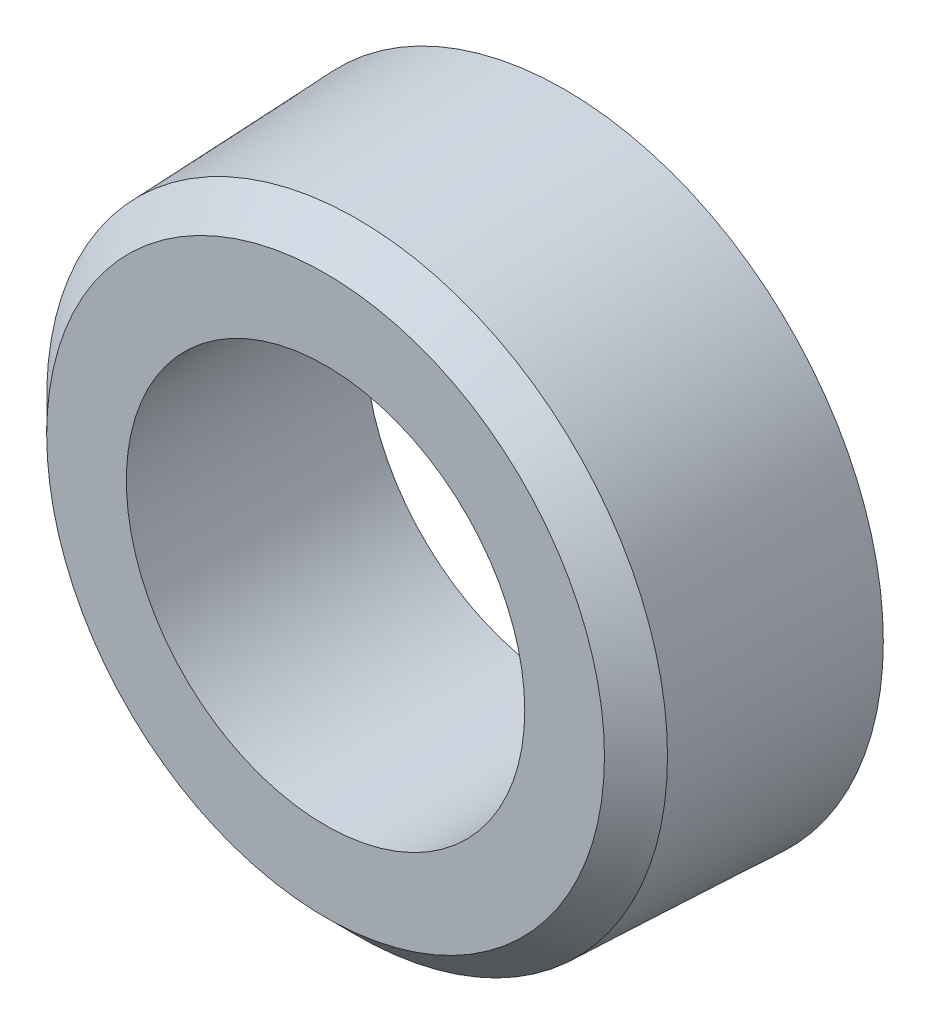
ISO-10303-21;
HEADER;
FILE_DESCRIPTION(('STEP AP214'),'2;1');
FILE_NAME('part.step','',(''),(''),'','','');
FILE_SCHEMA(('AUTOMOTIVE_DESIGN { 1 0 10303 214 1 1 1 1 }'));
ENDSEC;
DATA;
#1=APPLICATION_CONTEXT('core data for automotive mechanical design processes');
#2=APPLICATION_PROTOCOL_DEFINITION('international standard','automotive_design',2000,#1);
#3=PRODUCT_CONTEXT('',#1,'mechanical');
#4=PRODUCT('Part','Part','',(#3));
#5=PRODUCT_RELATED_PRODUCT_CATEGORY('part','',(#4));
#6=PRODUCT_DEFINITION_FORMATION('','',#4);
#7=PRODUCT_DEFINITION_CONTEXT('part definition',#1,'design');
#8=PRODUCT_DEFINITION('design','',#6,#7);
#9=PRODUCT_DEFINITION_SHAPE('','',#8);
#10=(LENGTH_UNIT() NAMED_UNIT(*) SI_UNIT(.MILLI.,.METRE.));
#11=(NAMED_UNIT(*) PLANE_ANGLE_UNIT() SI_UNIT($,.RADIAN.));
#12=(NAMED_UNIT(*) SI_UNIT($,.STERADIAN.) SOLID_ANGLE_UNIT());
#13=UNCERTAINTY_MEASURE_WITH_UNIT(LENGTH_MEASURE(1.E-05),#10,'distance_accuracy_value','');
#14=(GEOMETRIC_REPRESENTATION_CONTEXT(3) GLOBAL_UNCERTAINTY_ASSIGNED_CONTEXT((#13)) GLOBAL_UNIT_ASSIGNED_CONTEXT((#10,
#11,#12)) REPRESENTATION_CONTEXT('',''));
#15=CARTESIAN_POINT('',(0.,0.,0.));
#16=DIRECTION('',(0.,0.,1.));
#17=DIRECTION('',(1.,0.,0.));
#18=AXIS2_PLACEMENT_3D('',#15,#16,#17);
#19=CARTESIAN_POINT('',(0.,0.,6.));
#20=DIRECTION('',(0.,0.,-1.));
#21=DIRECTION('',(-1.,0.,0.));
#22=AXIS2_PLACEMENT_3D('',#19,#20,#21);
#23=CONICAL_SURFACE('',#22,7.,0.785398163397447);
#24=CARTESIAN_POINT('',(0.,0.,6.));
#25=DIRECTION('',(0.,0.,1.));
#26=DIRECTION('',(1.,0.,0.));
#27=AXIS2_PLACEMENT_3D('',#24,#25,#26);
#28=CIRCLE('',#27,7.);
#29=CARTESIAN_POINT('',(7.,0.,6.));
#30=VERTEX_POINT('',#29);
#31=EDGE_CURVE('E10',#30,#30,#28,.T.);
#32=ORIENTED_EDGE('',*,*,#31,.F.);
#33=EDGE_LOOP('',(#32));
#34=FACE_BOUND('',#33,.T.);
#35=CARTESIAN_POINT('',(0.,0.,5.20833333333333));
#36=DIRECTION('',(0.,0.,1.));
#37=DIRECTION('',(1.,0.,0.));
#38=AXIS2_PLACEMENT_3D('',#35,#36,#37);
#39=CIRCLE('',#38,7.79166666666667);
#40=CARTESIAN_POINT('',(7.79166666666667,0.,5.20833333333333));
#41=VERTEX_POINT('',#40);
#42=EDGE_CURVE('E33',#41,#41,#39,.T.);
#43=ORIENTED_EDGE('',*,*,#42,.T.);
#44=EDGE_LOOP('',(#43));
#45=FACE_BOUND('',#44,.T.);
#46=ADVANCED_FACE('F29',(#34,#45),#23,.T.);
#47=CARTESIAN_POINT('',(0.,0.,6.));
#48=DIRECTION('',(0.,0.,1.));
#49=DIRECTION('',(1.,0.,0.));
#50=AXIS2_PLACEMENT_3D('',#47,#48,#49);
#51=PLANE('',#50);
#52=ORIENTED_EDGE('',*,*,#31,.T.);
#53=EDGE_LOOP('',(#52));
#54=FACE_BOUND('',#53,.T.);
#55=CARTESIAN_POINT('',(0.,0.,6.));
#56=DIRECTION('',(0.,0.,1.));
#57=DIRECTION('',(1.,0.,0.));
#58=AXIS2_PLACEMENT_3D('',#55,#56,#57);
#59=CIRCLE('',#58,5.);
#60=CARTESIAN_POINT('',(5.,0.,6.));
#61=VERTEX_POINT('',#60);
#62=EDGE_CURVE('E37',#61,#61,#59,.T.);
#63=ORIENTED_EDGE('',*,*,#62,.F.);
#64=EDGE_LOOP('',(#63));
#65=FACE_BOUND('',#64,.T.);
#66=ADVANCED_FACE('F31',(#54,#65),#51,.T.);
#67=CARTESIAN_POINT('',(0.,0.,0.));
#68=DIRECTION('',(0.,0.,1.));
#69=DIRECTION('',(1.,0.,0.));
#70=AXIS2_PLACEMENT_3D('',#67,#68,#69);
#71=PLANE('',#70);
#72=CARTESIAN_POINT('',(0.,0.,0.));
#73=DIRECTION('',(0.,0.,1.));
#74=DIRECTION('',(1.,0.,0.));
#75=AXIS2_PLACEMENT_3D('',#72,#73,#74);
#76=CIRCLE('',#75,8.);
#77=CARTESIAN_POINT('',(8.,0.,0.));
#78=VERTEX_POINT('',#77);
#79=EDGE_CURVE('E46',#78,#78,#76,.T.);
#80=ORIENTED_EDGE('',*,*,#79,.F.);
#81=EDGE_LOOP('',(#80));
#82=FACE_BOUND('',#81,.T.);
#83=CARTESIAN_POINT('',(0.,0.,0.));
#84=DIRECTION('',(0.,0.,1.));
#85=DIRECTION('',(1.,0.,0.));
#86=AXIS2_PLACEMENT_3D('',#83,#84,#85);
#87=CIRCLE('',#86,5.);
#88=CARTESIAN_POINT('',(5.,0.,0.));
#89=VERTEX_POINT('',#88);
#90=EDGE_CURVE('E41',#89,#89,#87,.T.);
#91=ORIENTED_EDGE('',*,*,#90,.T.);
#92=EDGE_LOOP('',(#91));
#93=FACE_BOUND('',#92,.T.);
#94=ADVANCED_FACE('F62',(#82,#93),#71,.F.);
#95=CARTESIAN_POINT('',(0.,0.,6.));
#96=DIRECTION('',(0.,0.,-1.));
#97=DIRECTION('',(-1.,0.,0.));
#98=AXIS2_PLACEMENT_3D('',#95,#96,#97);
#99=CYLINDRICAL_SURFACE('',#98,5.);
#100=ORIENTED_EDGE('',*,*,#62,.T.);
#101=EDGE_LOOP('',(#100));
#102=FACE_BOUND('',#101,.T.);
#103=ORIENTED_EDGE('',*,*,#90,.F.);
#104=EDGE_LOOP('',(#103));
#105=FACE_BOUND('',#104,.T.);
#106=ADVANCED_FACE('F56',(#102,#105),#99,.F.);
#107=CARTESIAN_POINT('',(0.,0.,6.));
#108=DIRECTION('',(0.,0.,-1.));
#109=DIRECTION('',(-1.,0.,0.));
#110=AXIS2_PLACEMENT_3D('',#107,#108,#109);
#111=CONICAL_SURFACE('',#110,7.76,0.0399786871232902);
#112=ORIENTED_EDGE('',*,*,#42,.F.);
#113=EDGE_LOOP('',(#112));
#114=FACE_BOUND('',#113,.T.);
#115=ORIENTED_EDGE('',*,*,#79,.T.);
#116=EDGE_LOOP('',(#115));
#117=FACE_BOUND('',#116,.T.);
#118=ADVANCED_FACE('F54',(#114,#117),#111,.T.);
#119=CLOSED_SHELL('',(#46,#66,#94,#106,#118));
#120=MANIFOLD_SOLID_BREP('B2',#119);
#121=ADVANCED_BREP_SHAPE_REPRESENTATION('',(#18,#120),#14);
#122=SHAPE_DEFINITION_REPRESENTATION(#9,#121);
ENDSEC;
END-ISO-10303-21;
